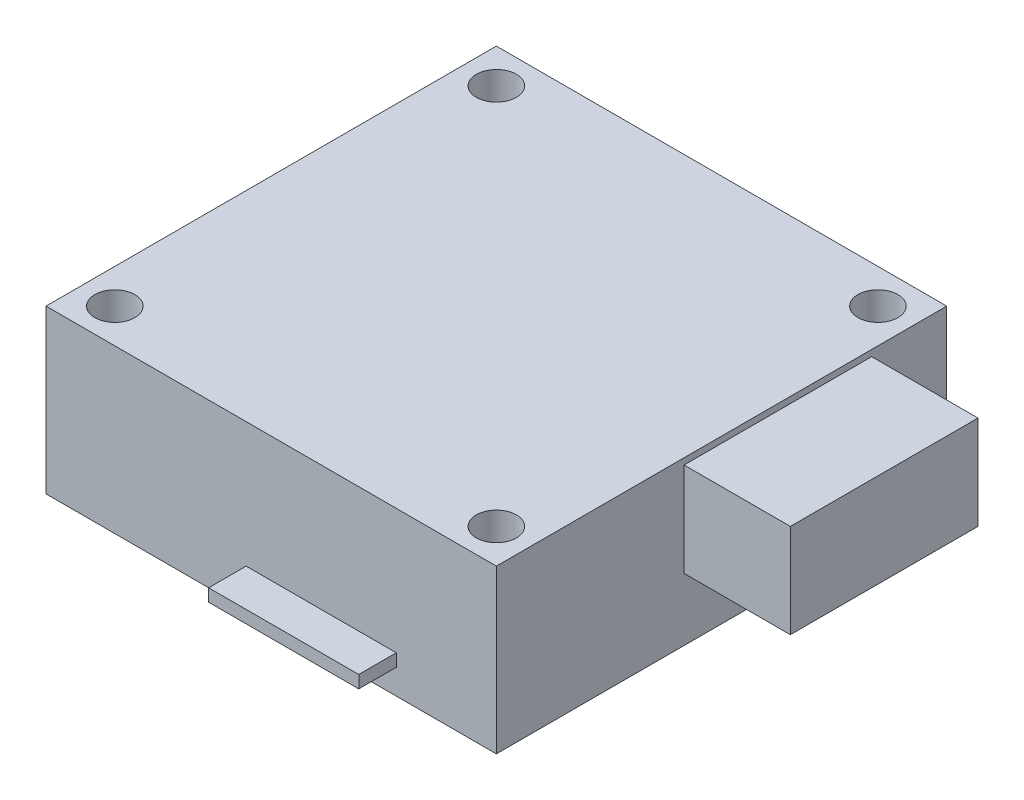
ISO-10303-21;
HEADER;
FILE_DESCRIPTION(('STEP AP214'),'2;1');
FILE_NAME('part.step','',(''),(''),'','','');
FILE_SCHEMA(('AUTOMOTIVE_DESIGN { 1 0 10303 214 1 1 1 1 }'));
ENDSEC;
DATA;
#1=APPLICATION_CONTEXT('core data for automotive mechanical design processes');
#2=APPLICATION_PROTOCOL_DEFINITION('international standard','automotive_design',2000,#1);
#3=PRODUCT_CONTEXT('',#1,'mechanical');
#4=PRODUCT('Part','Part','',(#3));
#5=PRODUCT_RELATED_PRODUCT_CATEGORY('part','',(#4));
#6=PRODUCT_DEFINITION_FORMATION('','',#4);
#7=PRODUCT_DEFINITION_CONTEXT('part definition',#1,'design');
#8=PRODUCT_DEFINITION('design','',#6,#7);
#9=PRODUCT_DEFINITION_SHAPE('','',#8);
#10=(LENGTH_UNIT() NAMED_UNIT(*) SI_UNIT(.MILLI.,.METRE.));
#11=(NAMED_UNIT(*) PLANE_ANGLE_UNIT() SI_UNIT($,.RADIAN.));
#12=(NAMED_UNIT(*) SI_UNIT($,.STERADIAN.) SOLID_ANGLE_UNIT());
#13=UNCERTAINTY_MEASURE_WITH_UNIT(LENGTH_MEASURE(1.E-05),#10,'distance_accuracy_value','');
#14=(GEOMETRIC_REPRESENTATION_CONTEXT(3) GLOBAL_UNCERTAINTY_ASSIGNED_CONTEXT((#13)) GLOBAL_UNIT_ASSIGNED_CONTEXT((#10,
#11,#12)) REPRESENTATION_CONTEXT('',''));
#15=CARTESIAN_POINT('',(0.,0.,0.));
#16=DIRECTION('',(0.,0.,1.));
#17=DIRECTION('',(1.,0.,0.));
#18=AXIS2_PLACEMENT_3D('',#15,#16,#17);
#19=CARTESIAN_POINT('',(-18.,13.,18.));
#20=DIRECTION('',(0.,0.,-1.));
#21=DIRECTION('',(-1.,0.,0.));
#22=AXIS2_PLACEMENT_3D('',#19,#20,#21);
#23=PLANE('',#22);
#24=DIRECTION('',(1.,0.,0.));
#25=VECTOR('',#24,1.);
#26=CARTESIAN_POINT('',(-18.,0.,18.));
#27=LINE('',#26,#25);
#28=CARTESIAN_POINT('',(-18.,0.,18.));
#29=VERTEX_POINT('',#28);
#30=CARTESIAN_POINT('',(18.,0.,18.));
#31=VERTEX_POINT('',#30);
#32=EDGE_CURVE('E221',#29,#31,#27,.T.);
#33=ORIENTED_EDGE('',*,*,#32,.T.);
#34=DIRECTION('',(0.,-1.,0.));
#35=VECTOR('',#34,1.);
#36=CARTESIAN_POINT('',(18.,13.,18.));
#37=LINE('',#36,#35);
#38=CARTESIAN_POINT('',(18.,13.,18.));
#39=VERTEX_POINT('',#38);
#40=EDGE_CURVE('E43',#39,#31,#37,.T.);
#41=ORIENTED_EDGE('',*,*,#40,.F.);
#42=DIRECTION('',(1.,0.,0.));
#43=VECTOR('',#42,1.);
#44=CARTESIAN_POINT('',(-18.,13.,18.));
#45=LINE('',#44,#43);
#46=CARTESIAN_POINT('',(-18.,13.,18.));
#47=VERTEX_POINT('',#46);
#48=EDGE_CURVE('E211',#47,#39,#45,.T.);
#49=ORIENTED_EDGE('',*,*,#48,.F.);
#50=DIRECTION('',(0.,-1.,0.));
#51=VECTOR('',#50,1.);
#52=CARTESIAN_POINT('',(-18.,13.,18.));
#53=LINE('',#52,#51);
#54=EDGE_CURVE('E11',#47,#29,#53,.T.);
#55=ORIENTED_EDGE('',*,*,#54,.T.);
#56=EDGE_LOOP('',(#33,#41,#49,#55));
#57=FACE_BOUND('',#56,.T.);
#58=DIRECTION('',(0.,-1.,0.));
#59=VECTOR('',#58,1.);
#60=CARTESIAN_POINT('',(-2.,3.,18.));
#61=LINE('',#60,#59);
#62=CARTESIAN_POINT('',(-2.,3.,18.));
#63=VERTEX_POINT('',#62);
#64=CARTESIAN_POINT('',(-1.99999999999999,2.,18.));
#65=VERTEX_POINT('',#64);
#66=EDGE_CURVE('E144',#63,#65,#61,.T.);
#67=ORIENTED_EDGE('',*,*,#66,.F.);
#68=DIRECTION('',(-1.,0.,0.));
#69=VECTOR('',#68,1.);
#70=CARTESIAN_POINT('',(-2.,3.,18.));
#71=LINE('',#70,#69);
#72=CARTESIAN_POINT('',(10.,3.,18.));
#73=VERTEX_POINT('',#72);
#74=EDGE_CURVE('E141',#73,#63,#71,.T.);
#75=ORIENTED_EDGE('',*,*,#74,.F.);
#76=DIRECTION('',(0.,1.,0.));
#77=VECTOR('',#76,1.);
#78=CARTESIAN_POINT('',(10.,3.,18.));
#79=LINE('',#78,#77);
#80=CARTESIAN_POINT('',(10.,2.,18.));
#81=VERTEX_POINT('',#80);
#82=EDGE_CURVE('E55',#81,#73,#79,.T.);
#83=ORIENTED_EDGE('',*,*,#82,.F.);
#84=DIRECTION('',(1.,0.,0.));
#85=VECTOR('',#84,1.);
#86=CARTESIAN_POINT('',(-2.,2.,18.));
#87=LINE('',#86,#85);
#88=EDGE_CURVE('E50',#65,#81,#87,.T.);
#89=ORIENTED_EDGE('',*,*,#88,.F.);
#90=EDGE_LOOP('',(#67,#75,#83,#89));
#91=FACE_BOUND('',#90,.T.);
#92=ADVANCED_FACE('F35',(#57,#91),#23,.F.);
#93=CARTESIAN_POINT('',(18.,13.,-18.));
#94=DIRECTION('',(-1.,0.,0.));
#95=DIRECTION('',(0.,0.,1.));
#96=AXIS2_PLACEMENT_3D('',#93,#94,#95);
#97=PLANE('',#96);
#98=DIRECTION('',(0.,0.,-1.));
#99=VECTOR('',#98,1.);
#100=CARTESIAN_POINT('',(18.,0.,-18.));
#101=LINE('',#100,#99);
#102=CARTESIAN_POINT('',(18.,0.,-18.));
#103=VERTEX_POINT('',#102);
#104=EDGE_CURVE('E223',#31,#103,#101,.T.);
#105=ORIENTED_EDGE('',*,*,#104,.T.);
#106=DIRECTION('',(0.,-1.,0.));
#107=VECTOR('',#106,1.);
#108=CARTESIAN_POINT('',(18.,13.,-18.));
#109=LINE('',#108,#107);
#110=CARTESIAN_POINT('',(18.,13.,-18.));
#111=VERTEX_POINT('',#110);
#112=EDGE_CURVE('E228',#111,#103,#109,.T.);
#113=ORIENTED_EDGE('',*,*,#112,.F.);
#114=DIRECTION('',(0.,0.,-1.));
#115=VECTOR('',#114,1.);
#116=CARTESIAN_POINT('',(18.,13.,-18.));
#117=LINE('',#116,#115);
#118=EDGE_CURVE('E214',#39,#111,#117,.T.);
#119=ORIENTED_EDGE('',*,*,#118,.F.);
#120=ORIENTED_EDGE('',*,*,#40,.T.);
#121=EDGE_LOOP('',(#105,#113,#119,#120));
#122=FACE_BOUND('',#121,.T.);
#123=DIRECTION('',(0.,-1.,0.));
#124=VECTOR('',#123,1.);
#125=CARTESIAN_POINT('',(18.,12.5,3.));
#126=LINE('',#125,#124);
#127=CARTESIAN_POINT('',(18.,12.5,3.));
#128=VERTEX_POINT('',#127);
#129=CARTESIAN_POINT('',(18.,5.,3.));
#130=VERTEX_POINT('',#129);
#131=EDGE_CURVE('E145',#128,#130,#126,.T.);
#132=ORIENTED_EDGE('',*,*,#131,.F.);
#133=DIRECTION('',(0.,0.,1.));
#134=VECTOR('',#133,1.);
#135=CARTESIAN_POINT('',(18.,12.5,3.));
#136=LINE('',#135,#134);
#137=CARTESIAN_POINT('',(18.,12.5,-12.));
#138=VERTEX_POINT('',#137);
#139=EDGE_CURVE('E158',#138,#128,#136,.T.);
#140=ORIENTED_EDGE('',*,*,#139,.F.);
#141=DIRECTION('',(0.,1.,0.));
#142=VECTOR('',#141,1.);
#143=CARTESIAN_POINT('',(18.,12.5,-12.));
#144=LINE('',#143,#142);
#145=CARTESIAN_POINT('',(18.,5.,-12.));
#146=VERTEX_POINT('',#145);
#147=EDGE_CURVE('E167',#146,#138,#144,.T.);
#148=ORIENTED_EDGE('',*,*,#147,.F.);
#149=DIRECTION('',(0.,0.,-1.));
#150=VECTOR('',#149,1.);
#151=CARTESIAN_POINT('',(18.,5.,3.));
#152=LINE('',#151,#150);
#153=EDGE_CURVE('E148',#130,#146,#152,.T.);
#154=ORIENTED_EDGE('',*,*,#153,.F.);
#155=EDGE_LOOP('',(#132,#140,#148,#154));
#156=FACE_BOUND('',#155,.T.);
#157=ADVANCED_FACE('F235',(#122,#156),#97,.F.);
#158=CARTESIAN_POINT('',(0.,13.,0.));
#159=DIRECTION('',(0.,1.,0.));
#160=DIRECTION('',(0.,0.,1.));
#161=AXIS2_PLACEMENT_3D('',#158,#159,#160);
#162=PLANE('',#161);
#163=CARTESIAN_POINT('',(15.25,13.,15.25));
#164=DIRECTION('',(0.,1.,0.));
#165=DIRECTION('',(0.,0.,1.));
#166=AXIS2_PLACEMENT_3D('',#163,#164,#165);
#167=CIRCLE('',#166,1.6);
#168=CARTESIAN_POINT('',(15.25,13.,13.65));
#169=VERTEX_POINT('',#168);
#170=EDGE_CURVE('E190',#169,#169,#167,.T.);
#171=ORIENTED_EDGE('',*,*,#170,.F.);
#172=EDGE_LOOP('',(#171));
#173=FACE_BOUND('',#172,.T.);
#174=CARTESIAN_POINT('',(-15.25,13.,-15.25));
#175=DIRECTION('',(0.,1.,0.));
#176=DIRECTION('',(0.,0.,1.));
#177=AXIS2_PLACEMENT_3D('',#174,#175,#176);
#178=CIRCLE('',#177,1.6);
#179=CARTESIAN_POINT('',(-15.25,13.,-16.85));
#180=VERTEX_POINT('',#179);
#181=EDGE_CURVE('E202',#180,#180,#178,.T.);
#182=ORIENTED_EDGE('',*,*,#181,.F.);
#183=EDGE_LOOP('',(#182));
#184=FACE_BOUND('',#183,.T.);
#185=DIRECTION('',(0.,0.,1.));
#186=VECTOR('',#185,1.);
#187=CARTESIAN_POINT('',(-18.,13.,-18.));
#188=LINE('',#187,#186);
#189=CARTESIAN_POINT('',(-18.,13.,-18.));
#190=VERTEX_POINT('',#189);
#191=EDGE_CURVE('E208',#190,#47,#188,.T.);
#192=ORIENTED_EDGE('',*,*,#191,.T.);
#193=ORIENTED_EDGE('',*,*,#48,.T.);
#194=ORIENTED_EDGE('',*,*,#118,.T.);
#195=DIRECTION('',(-1.,0.,0.));
#196=VECTOR('',#195,1.);
#197=CARTESIAN_POINT('',(-18.,13.,-18.));
#198=LINE('',#197,#196);
#199=EDGE_CURVE('E216',#111,#190,#198,.T.);
#200=ORIENTED_EDGE('',*,*,#199,.T.);
#201=EDGE_LOOP('',(#192,#193,#194,#200));
#202=FACE_BOUND('',#201,.T.);
#203=CARTESIAN_POINT('',(15.25,13.,-15.25));
#204=DIRECTION('',(0.,1.,0.));
#205=DIRECTION('',(0.,0.,-1.));
#206=AXIS2_PLACEMENT_3D('',#203,#204,#205);
#207=CIRCLE('',#206,1.6);
#208=CARTESIAN_POINT('',(15.25,13.,-16.85));
#209=VERTEX_POINT('',#208);
#210=EDGE_CURVE('E196',#209,#209,#207,.T.);
#211=ORIENTED_EDGE('',*,*,#210,.F.);
#212=EDGE_LOOP('',(#211));
#213=FACE_BOUND('',#212,.T.);
#214=CARTESIAN_POINT('',(-15.25,13.,15.25));
#215=DIRECTION('',(0.,1.,0.));
#216=DIRECTION('',(0.,0.,-1.));
#217=AXIS2_PLACEMENT_3D('',#214,#215,#216);
#218=CIRCLE('',#217,1.6);
#219=CARTESIAN_POINT('',(-15.25,13.,13.65));
#220=VERTEX_POINT('',#219);
#221=EDGE_CURVE('E184',#220,#220,#218,.T.);
#222=ORIENTED_EDGE('',*,*,#221,.F.);
#223=EDGE_LOOP('',(#222));
#224=FACE_BOUND('',#223,.T.);
#225=ADVANCED_FACE('F252',(#173,#184,#202,#213,#224),#162,.T.);
#226=CARTESIAN_POINT('',(0.,0.,0.));
#227=DIRECTION('',(0.,1.,0.));
#228=DIRECTION('',(0.,0.,1.));
#229=AXIS2_PLACEMENT_3D('',#226,#227,#228);
#230=PLANE('',#229);
#231=DIRECTION('',(0.,0.,1.));
#232=VECTOR('',#231,1.);
#233=CARTESIAN_POINT('',(-18.,0.,-18.));
#234=LINE('',#233,#232);
#235=CARTESIAN_POINT('',(-18.,0.,-18.));
#236=VERTEX_POINT('',#235);
#237=EDGE_CURVE('E205',#236,#29,#234,.T.);
#238=ORIENTED_EDGE('',*,*,#237,.F.);
#239=DIRECTION('',(-1.,0.,0.));
#240=VECTOR('',#239,1.);
#241=CARTESIAN_POINT('',(-18.,0.,-18.));
#242=LINE('',#241,#240);
#243=EDGE_CURVE('E212',#103,#236,#242,.T.);
#244=ORIENTED_EDGE('',*,*,#243,.F.);
#245=ORIENTED_EDGE('',*,*,#104,.F.);
#246=ORIENTED_EDGE('',*,*,#32,.F.);
#247=EDGE_LOOP('',(#238,#244,#245,#246));
#248=FACE_BOUND('',#247,.T.);
#249=CARTESIAN_POINT('',(-15.25,0.,-15.25));
#250=DIRECTION('',(0.,1.,0.));
#251=DIRECTION('',(0.,0.,1.));
#252=AXIS2_PLACEMENT_3D('',#249,#250,#251);
#253=CIRCLE('',#252,1.6);
#254=CARTESIAN_POINT('',(-15.25,0.,-16.85));
#255=VERTEX_POINT('',#254);
#256=EDGE_CURVE('E199',#255,#255,#253,.T.);
#257=ORIENTED_EDGE('',*,*,#256,.T.);
#258=EDGE_LOOP('',(#257));
#259=FACE_BOUND('',#258,.T.);
#260=CARTESIAN_POINT('',(15.25,0.,-15.25));
#261=DIRECTION('',(0.,1.,0.));
#262=DIRECTION('',(0.,0.,-1.));
#263=AXIS2_PLACEMENT_3D('',#260,#261,#262);
#264=CIRCLE('',#263,1.6);
#265=CARTESIAN_POINT('',(15.25,0.,-16.85));
#266=VERTEX_POINT('',#265);
#267=EDGE_CURVE('E193',#266,#266,#264,.T.);
#268=ORIENTED_EDGE('',*,*,#267,.T.);
#269=EDGE_LOOP('',(#268));
#270=FACE_BOUND('',#269,.T.);
#271=CARTESIAN_POINT('',(15.25,0.,15.25));
#272=DIRECTION('',(0.,1.,0.));
#273=DIRECTION('',(0.,0.,1.));
#274=AXIS2_PLACEMENT_3D('',#271,#272,#273);
#275=CIRCLE('',#274,1.6);
#276=CARTESIAN_POINT('',(15.25,0.,13.65));
#277=VERTEX_POINT('',#276);
#278=EDGE_CURVE('E187',#277,#277,#275,.T.);
#279=ORIENTED_EDGE('',*,*,#278,.T.);
#280=EDGE_LOOP('',(#279));
#281=FACE_BOUND('',#280,.T.);
#282=CARTESIAN_POINT('',(-15.25,0.,15.25));
#283=DIRECTION('',(0.,1.,0.));
#284=DIRECTION('',(0.,0.,-1.));
#285=AXIS2_PLACEMENT_3D('',#282,#283,#284);
#286=CIRCLE('',#285,1.6);
#287=CARTESIAN_POINT('',(-15.25,0.,13.65));
#288=VERTEX_POINT('',#287);
#289=EDGE_CURVE('E183',#288,#288,#286,.T.);
#290=ORIENTED_EDGE('',*,*,#289,.T.);
#291=EDGE_LOOP('',(#290));
#292=FACE_BOUND('',#291,.T.);
#293=ADVANCED_FACE('F242',(#248,#259,#270,#281,#292),#230,.F.);
#294=CARTESIAN_POINT('',(-18.,13.,-18.));
#295=DIRECTION('',(1.,0.,0.));
#296=DIRECTION('',(0.,0.,-1.));
#297=AXIS2_PLACEMENT_3D('',#294,#295,#296);
#298=PLANE('',#297);
#299=ORIENTED_EDGE('',*,*,#237,.T.);
#300=ORIENTED_EDGE('',*,*,#54,.F.);
#301=ORIENTED_EDGE('',*,*,#191,.F.);
#302=DIRECTION('',(0.,-1.,0.));
#303=VECTOR('',#302,1.);
#304=CARTESIAN_POINT('',(-18.,13.,-18.));
#305=LINE('',#304,#303);
#306=EDGE_CURVE('E218',#190,#236,#305,.T.);
#307=ORIENTED_EDGE('',*,*,#306,.T.);
#308=EDGE_LOOP('',(#299,#300,#301,#307));
#309=FACE_BOUND('',#308,.T.);
#310=ADVANCED_FACE('F37',(#309),#298,.F.);
#311=CARTESIAN_POINT('',(-18.,13.,-18.));
#312=DIRECTION('',(0.,0.,1.));
#313=DIRECTION('',(1.,0.,0.));
#314=AXIS2_PLACEMENT_3D('',#311,#312,#313);
#315=PLANE('',#314);
#316=ORIENTED_EDGE('',*,*,#243,.T.);
#317=ORIENTED_EDGE('',*,*,#306,.F.);
#318=ORIENTED_EDGE('',*,*,#199,.F.);
#319=ORIENTED_EDGE('',*,*,#112,.T.);
#320=EDGE_LOOP('',(#316,#317,#318,#319));
#321=FACE_BOUND('',#320,.T.);
#322=ADVANCED_FACE('F246',(#321),#315,.F.);
#323=CARTESIAN_POINT('',(-15.25,13.,-15.25));
#324=DIRECTION('',(0.,-1.,0.));
#325=DIRECTION('',(0.,0.,-1.));
#326=AXIS2_PLACEMENT_3D('',#323,#324,#325);
#327=CYLINDRICAL_SURFACE('',#326,1.6);
#328=CARTESIAN_POINT('',(-15.25,13.,-16.85));
#329=CARTESIAN_POINT('',(-15.25,12.8645833333333,-16.85));
#330=CARTESIAN_POINT('',(-15.25,12.7291666666667,-16.85));
#331=CARTESIAN_POINT('',(-15.25,12.4583333333333,-16.85));
#332=CARTESIAN_POINT('',(-15.25,12.3229166666667,-16.85));
#333=CARTESIAN_POINT('',(-15.25,12.0520833333333,-16.85));
#334=CARTESIAN_POINT('',(-15.25,11.9166666666667,-16.85));
#335=CARTESIAN_POINT('',(-15.25,11.6458333333333,-16.85));
#336=CARTESIAN_POINT('',(-15.25,11.5104166666667,-16.85));
#337=CARTESIAN_POINT('',(-15.25,11.2395833333333,-16.85));
#338=CARTESIAN_POINT('',(-15.25,11.1041666666667,-16.85));
#339=CARTESIAN_POINT('',(-15.25,10.8333333333333,-16.85));
#340=CARTESIAN_POINT('',(-15.25,10.6979166666667,-16.85));
#341=CARTESIAN_POINT('',(-15.25,10.4270833333333,-16.85));
#342=CARTESIAN_POINT('',(-15.25,10.2916666666667,-16.85));
#343=CARTESIAN_POINT('',(-15.25,10.0208333333333,-16.85));
#344=CARTESIAN_POINT('',(-15.25,9.88541666666667,-16.85));
#345=CARTESIAN_POINT('',(-15.25,9.61458333333333,-16.85));
#346=CARTESIAN_POINT('',(-15.25,9.47916666666667,-16.85));
#347=CARTESIAN_POINT('',(-15.25,9.20833333333333,-16.85));
#348=CARTESIAN_POINT('',(-15.25,9.07291666666666,-16.85));
#349=CARTESIAN_POINT('',(-15.25,8.80208333333333,-16.85));
#350=CARTESIAN_POINT('',(-15.25,8.66666666666667,-16.85));
#351=CARTESIAN_POINT('',(-15.25,8.39583333333333,-16.85));
#352=CARTESIAN_POINT('',(-15.25,8.26041666666667,-16.85));
#353=CARTESIAN_POINT('',(-15.25,7.98958333333333,-16.85));
#354=CARTESIAN_POINT('',(-15.25,7.85416666666667,-16.85));
#355=CARTESIAN_POINT('',(-15.25,7.58333333333333,-16.85));
#356=CARTESIAN_POINT('',(-15.25,7.44791666666667,-16.85));
#357=CARTESIAN_POINT('',(-15.25,7.17708333333333,-16.85));
#358=CARTESIAN_POINT('',(-15.25,7.04166666666667,-16.85));
#359=CARTESIAN_POINT('',(-15.25,6.77083333333333,-16.85));
#360=CARTESIAN_POINT('',(-15.25,6.63541666666667,-16.85));
#361=CARTESIAN_POINT('',(-15.25,6.36458333333333,-16.85));
#362=CARTESIAN_POINT('',(-15.25,6.22916666666667,-16.85));
#363=CARTESIAN_POINT('',(-15.25,5.95833333333333,-16.85));
#364=CARTESIAN_POINT('',(-15.25,5.82291666666667,-16.85));
#365=CARTESIAN_POINT('',(-15.25,5.55208333333333,-16.85));
#366=CARTESIAN_POINT('',(-15.25,5.41666666666667,-16.85));
#367=CARTESIAN_POINT('',(-15.25,5.14583333333333,-16.85));
#368=CARTESIAN_POINT('',(-15.25,5.01041666666667,-16.85));
#369=CARTESIAN_POINT('',(-15.25,4.73958333333333,-16.85));
#370=CARTESIAN_POINT('',(-15.25,4.60416666666667,-16.85));
#371=CARTESIAN_POINT('',(-15.25,4.33333333333333,-16.85));
#372=CARTESIAN_POINT('',(-15.25,4.19791666666667,-16.85));
#373=CARTESIAN_POINT('',(-15.25,3.92708333333333,-16.85));
#374=CARTESIAN_POINT('',(-15.25,3.79166666666667,-16.85));
#375=CARTESIAN_POINT('',(-15.25,3.52083333333333,-16.85));
#376=CARTESIAN_POINT('',(-15.25,3.38541666666667,-16.85));
#377=CARTESIAN_POINT('',(-15.25,3.11458333333333,-16.85));
#378=CARTESIAN_POINT('',(-15.25,2.97916666666667,-16.85));
#379=CARTESIAN_POINT('',(-15.25,2.70833333333333,-16.85));
#380=CARTESIAN_POINT('',(-15.25,2.57291666666667,-16.85));
#381=CARTESIAN_POINT('',(-15.25,2.30208333333333,-16.85));
#382=CARTESIAN_POINT('',(-15.25,2.16666666666667,-16.85));
#383=CARTESIAN_POINT('',(-15.25,1.89583333333333,-16.85));
#384=CARTESIAN_POINT('',(-15.25,1.76041666666667,-16.85));
#385=CARTESIAN_POINT('',(-15.25,1.48958333333333,-16.85));
#386=CARTESIAN_POINT('',(-15.25,1.35416666666667,-16.85));
#387=CARTESIAN_POINT('',(-15.25,1.08333333333333,-16.85));
#388=CARTESIAN_POINT('',(-15.25,0.947916666666667,-16.85));
#389=CARTESIAN_POINT('',(-15.25,0.677083333333334,-16.85));
#390=CARTESIAN_POINT('',(-15.25,0.541666666666667,-16.85));
#391=CARTESIAN_POINT('',(-15.25,0.270833333333334,-16.85));
#392=CARTESIAN_POINT('',(-15.25,0.135416666666667,-16.85));
#393=CARTESIAN_POINT('',(-15.25,0.,-16.85));
#394=B_SPLINE_CURVE_WITH_KNOTS('',3,(#328,#329,#330,#331,#332,#333,#334,#335,#336,#337,#338,
#339,#340,#341,#342,#343,#344,#345,#346,#347,#348,#349,#350,#351,#352,#353,#354,#355,#356,#357,
#358,#359,#360,#361,#362,#363,#364,#365,#366,#367,#368,#369,#370,#371,#372,#373,#374,#375,#376,
#377,#378,#379,#380,#381,#382,#383,#384,#385,#386,#387,#388,#389,#390,#391,#392,#393),
.UNSPECIFIED.,.F.,.F.,(4,2,2,2,2,2,2,2,2,2,2,2,2,2,2,2,2,2,2,2,2,2,2,2,2,2,2,2,2,2,2,2,4),(0.,
0.40625,0.812500000000001,1.21875,1.625,2.03125,2.4375,2.84375,3.25,3.65625,4.0625,4.46875,
4.875,5.28125,5.6875,6.09375,6.5,6.90625,7.3125,7.71875,8.125,8.53125,8.9375,9.34375,9.75,
10.15625,10.5625,10.96875,11.375,11.78125,12.1875,12.59375,13.),.UNSPECIFIED.);
#395=EDGE_CURVE('BSEAM313',#180,#255,#394,.T.);
#396=ORIENTED_EDGE('',*,*,#181,.T.);
#397=ORIENTED_EDGE('',*,*,#256,.F.);
#398=ORIENTED_EDGE('',*,*,#395,.T.);
#399=ORIENTED_EDGE('',*,*,#395,.F.);
#400=EDGE_LOOP('',(#396,#398,#397,#399));
#401=FACE_BOUND('',#400,.T.);
#402=ADVANCED_FACE('F313',(#401),#327,.F.);
#403=CARTESIAN_POINT('',(15.25,13.,-15.25));
#404=DIRECTION('',(0.,-1.,0.));
#405=DIRECTION('',(0.,0.,-1.));
#406=AXIS2_PLACEMENT_3D('',#403,#404,#405);
#407=CYLINDRICAL_SURFACE('',#406,1.6);
#408=CARTESIAN_POINT('',(15.25,13.,-16.85));
#409=CARTESIAN_POINT('',(15.25,12.8645833333333,-16.85));
#410=CARTESIAN_POINT('',(15.25,12.7291666666667,-16.85));
#411=CARTESIAN_POINT('',(15.25,12.4583333333333,-16.85));
#412=CARTESIAN_POINT('',(15.25,12.3229166666667,-16.85));
#413=CARTESIAN_POINT('',(15.25,12.0520833333333,-16.85));
#414=CARTESIAN_POINT('',(15.25,11.9166666666667,-16.85));
#415=CARTESIAN_POINT('',(15.25,11.6458333333333,-16.85));
#416=CARTESIAN_POINT('',(15.25,11.5104166666667,-16.85));
#417=CARTESIAN_POINT('',(15.25,11.2395833333333,-16.85));
#418=CARTESIAN_POINT('',(15.25,11.1041666666667,-16.85));
#419=CARTESIAN_POINT('',(15.25,10.8333333333333,-16.85));
#420=CARTESIAN_POINT('',(15.25,10.6979166666667,-16.85));
#421=CARTESIAN_POINT('',(15.25,10.4270833333333,-16.85));
#422=CARTESIAN_POINT('',(15.25,10.2916666666667,-16.85));
#423=CARTESIAN_POINT('',(15.25,10.0208333333333,-16.85));
#424=CARTESIAN_POINT('',(15.25,9.88541666666667,-16.85));
#425=CARTESIAN_POINT('',(15.25,9.61458333333333,-16.85));
#426=CARTESIAN_POINT('',(15.25,9.47916666666667,-16.85));
#427=CARTESIAN_POINT('',(15.25,9.20833333333333,-16.85));
#428=CARTESIAN_POINT('',(15.25,9.07291666666666,-16.85));
#429=CARTESIAN_POINT('',(15.25,8.80208333333333,-16.85));
#430=CARTESIAN_POINT('',(15.25,8.66666666666667,-16.85));
#431=CARTESIAN_POINT('',(15.25,8.39583333333333,-16.85));
#432=CARTESIAN_POINT('',(15.25,8.26041666666667,-16.85));
#433=CARTESIAN_POINT('',(15.25,7.98958333333333,-16.85));
#434=CARTESIAN_POINT('',(15.25,7.85416666666667,-16.85));
#435=CARTESIAN_POINT('',(15.25,7.58333333333333,-16.85));
#436=CARTESIAN_POINT('',(15.25,7.44791666666667,-16.85));
#437=CARTESIAN_POINT('',(15.25,7.17708333333333,-16.85));
#438=CARTESIAN_POINT('',(15.25,7.04166666666667,-16.85));
#439=CARTESIAN_POINT('',(15.25,6.77083333333333,-16.85));
#440=CARTESIAN_POINT('',(15.25,6.63541666666667,-16.85));
#441=CARTESIAN_POINT('',(15.25,6.36458333333333,-16.85));
#442=CARTESIAN_POINT('',(15.25,6.22916666666667,-16.85));
#443=CARTESIAN_POINT('',(15.25,5.95833333333333,-16.85));
#444=CARTESIAN_POINT('',(15.25,5.82291666666667,-16.85));
#445=CARTESIAN_POINT('',(15.25,5.55208333333333,-16.85));
#446=CARTESIAN_POINT('',(15.25,5.41666666666667,-16.85));
#447=CARTESIAN_POINT('',(15.25,5.14583333333333,-16.85));
#448=CARTESIAN_POINT('',(15.25,5.01041666666667,-16.85));
#449=CARTESIAN_POINT('',(15.25,4.73958333333333,-16.85));
#450=CARTESIAN_POINT('',(15.25,4.60416666666667,-16.85));
#451=CARTESIAN_POINT('',(15.25,4.33333333333333,-16.85));
#452=CARTESIAN_POINT('',(15.25,4.19791666666667,-16.85));
#453=CARTESIAN_POINT('',(15.25,3.92708333333333,-16.85));
#454=CARTESIAN_POINT('',(15.25,3.79166666666667,-16.85));
#455=CARTESIAN_POINT('',(15.25,3.52083333333333,-16.85));
#456=CARTESIAN_POINT('',(15.25,3.38541666666667,-16.85));
#457=CARTESIAN_POINT('',(15.25,3.11458333333333,-16.85));
#458=CARTESIAN_POINT('',(15.25,2.97916666666667,-16.85));
#459=CARTESIAN_POINT('',(15.25,2.70833333333333,-16.85));
#460=CARTESIAN_POINT('',(15.25,2.57291666666667,-16.85));
#461=CARTESIAN_POINT('',(15.25,2.30208333333333,-16.85));
#462=CARTESIAN_POINT('',(15.25,2.16666666666667,-16.85));
#463=CARTESIAN_POINT('',(15.25,1.89583333333333,-16.85));
#464=CARTESIAN_POINT('',(15.25,1.76041666666667,-16.85));
#465=CARTESIAN_POINT('',(15.25,1.48958333333333,-16.85));
#466=CARTESIAN_POINT('',(15.25,1.35416666666667,-16.85));
#467=CARTESIAN_POINT('',(15.25,1.08333333333333,-16.85));
#468=CARTESIAN_POINT('',(15.25,0.947916666666667,-16.85));
#469=CARTESIAN_POINT('',(15.25,0.677083333333334,-16.85));
#470=CARTESIAN_POINT('',(15.25,0.541666666666667,-16.85));
#471=CARTESIAN_POINT('',(15.25,0.270833333333334,-16.85));
#472=CARTESIAN_POINT('',(15.25,0.135416666666667,-16.85));
#473=CARTESIAN_POINT('',(15.25,0.,-16.85));
#474=B_SPLINE_CURVE_WITH_KNOTS('',3,(#408,#409,#410,#411,#412,#413,#414,#415,#416,#417,#418,
#419,#420,#421,#422,#423,#424,#425,#426,#427,#428,#429,#430,#431,#432,#433,#434,#435,#436,#437,
#438,#439,#440,#441,#442,#443,#444,#445,#446,#447,#448,#449,#450,#451,#452,#453,#454,#455,#456,
#457,#458,#459,#460,#461,#462,#463,#464,#465,#466,#467,#468,#469,#470,#471,#472,#473),
.UNSPECIFIED.,.F.,.F.,(4,2,2,2,2,2,2,2,2,2,2,2,2,2,2,2,2,2,2,2,2,2,2,2,2,2,2,2,2,2,2,2,4),(0.,
0.40625,0.812500000000001,1.21875,1.625,2.03125,2.4375,2.84375,3.25,3.65625,4.0625,4.46875,
4.875,5.28125,5.6875,6.09375,6.5,6.90625,7.3125,7.71875,8.125,8.53125,8.9375,9.34375,9.75,
10.15625,10.5625,10.96875,11.375,11.78125,12.1875,12.59375,13.),.UNSPECIFIED.);
#475=EDGE_CURVE('BSEAM309',#209,#266,#474,.T.);
#476=ORIENTED_EDGE('',*,*,#210,.T.);
#477=ORIENTED_EDGE('',*,*,#267,.F.);
#478=ORIENTED_EDGE('',*,*,#475,.T.);
#479=ORIENTED_EDGE('',*,*,#475,.F.);
#480=EDGE_LOOP('',(#476,#478,#477,#479));
#481=FACE_BOUND('',#480,.T.);
#482=ADVANCED_FACE('F309',(#481),#407,.F.);
#483=CARTESIAN_POINT('',(15.25,13.,15.25));
#484=DIRECTION('',(0.,-1.,0.));
#485=DIRECTION('',(0.,0.,-1.));
#486=AXIS2_PLACEMENT_3D('',#483,#484,#485);
#487=CYLINDRICAL_SURFACE('',#486,1.6);
#488=CARTESIAN_POINT('',(15.25,13.,13.65));
#489=CARTESIAN_POINT('',(15.25,12.8645833333333,13.65));
#490=CARTESIAN_POINT('',(15.25,12.7291666666667,13.65));
#491=CARTESIAN_POINT('',(15.25,12.4583333333333,13.65));
#492=CARTESIAN_POINT('',(15.25,12.3229166666667,13.65));
#493=CARTESIAN_POINT('',(15.25,12.0520833333333,13.65));
#494=CARTESIAN_POINT('',(15.25,11.9166666666667,13.65));
#495=CARTESIAN_POINT('',(15.25,11.6458333333333,13.65));
#496=CARTESIAN_POINT('',(15.25,11.5104166666667,13.65));
#497=CARTESIAN_POINT('',(15.25,11.2395833333333,13.65));
#498=CARTESIAN_POINT('',(15.25,11.1041666666667,13.65));
#499=CARTESIAN_POINT('',(15.25,10.8333333333333,13.65));
#500=CARTESIAN_POINT('',(15.25,10.6979166666667,13.65));
#501=CARTESIAN_POINT('',(15.25,10.4270833333333,13.65));
#502=CARTESIAN_POINT('',(15.25,10.2916666666667,13.65));
#503=CARTESIAN_POINT('',(15.25,10.0208333333333,13.65));
#504=CARTESIAN_POINT('',(15.25,9.88541666666667,13.65));
#505=CARTESIAN_POINT('',(15.25,9.61458333333333,13.65));
#506=CARTESIAN_POINT('',(15.25,9.47916666666667,13.65));
#507=CARTESIAN_POINT('',(15.25,9.20833333333333,13.65));
#508=CARTESIAN_POINT('',(15.25,9.07291666666666,13.65));
#509=CARTESIAN_POINT('',(15.25,8.80208333333333,13.65));
#510=CARTESIAN_POINT('',(15.25,8.66666666666667,13.65));
#511=CARTESIAN_POINT('',(15.25,8.39583333333333,13.65));
#512=CARTESIAN_POINT('',(15.25,8.26041666666667,13.65));
#513=CARTESIAN_POINT('',(15.25,7.98958333333333,13.65));
#514=CARTESIAN_POINT('',(15.25,7.85416666666667,13.65));
#515=CARTESIAN_POINT('',(15.25,7.58333333333333,13.65));
#516=CARTESIAN_POINT('',(15.25,7.44791666666667,13.65));
#517=CARTESIAN_POINT('',(15.25,7.17708333333333,13.65));
#518=CARTESIAN_POINT('',(15.25,7.04166666666667,13.65));
#519=CARTESIAN_POINT('',(15.25,6.77083333333333,13.65));
#520=CARTESIAN_POINT('',(15.25,6.63541666666667,13.65));
#521=CARTESIAN_POINT('',(15.25,6.36458333333333,13.65));
#522=CARTESIAN_POINT('',(15.25,6.22916666666667,13.65));
#523=CARTESIAN_POINT('',(15.25,5.95833333333333,13.65));
#524=CARTESIAN_POINT('',(15.25,5.82291666666667,13.65));
#525=CARTESIAN_POINT('',(15.25,5.55208333333333,13.65));
#526=CARTESIAN_POINT('',(15.25,5.41666666666667,13.65));
#527=CARTESIAN_POINT('',(15.25,5.14583333333333,13.65));
#528=CARTESIAN_POINT('',(15.25,5.01041666666667,13.65));
#529=CARTESIAN_POINT('',(15.25,4.73958333333333,13.65));
#530=CARTESIAN_POINT('',(15.25,4.60416666666667,13.65));
#531=CARTESIAN_POINT('',(15.25,4.33333333333333,13.65));
#532=CARTESIAN_POINT('',(15.25,4.19791666666667,13.65));
#533=CARTESIAN_POINT('',(15.25,3.92708333333333,13.65));
#534=CARTESIAN_POINT('',(15.25,3.79166666666667,13.65));
#535=CARTESIAN_POINT('',(15.25,3.52083333333333,13.65));
#536=CARTESIAN_POINT('',(15.25,3.38541666666667,13.65));
#537=CARTESIAN_POINT('',(15.25,3.11458333333333,13.65));
#538=CARTESIAN_POINT('',(15.25,2.97916666666667,13.65));
#539=CARTESIAN_POINT('',(15.25,2.70833333333333,13.65));
#540=CARTESIAN_POINT('',(15.25,2.57291666666667,13.65));
#541=CARTESIAN_POINT('',(15.25,2.30208333333333,13.65));
#542=CARTESIAN_POINT('',(15.25,2.16666666666667,13.65));
#543=CARTESIAN_POINT('',(15.25,1.89583333333333,13.65));
#544=CARTESIAN_POINT('',(15.25,1.76041666666667,13.65));
#545=CARTESIAN_POINT('',(15.25,1.48958333333333,13.65));
#546=CARTESIAN_POINT('',(15.25,1.35416666666667,13.65));
#547=CARTESIAN_POINT('',(15.25,1.08333333333333,13.65));
#548=CARTESIAN_POINT('',(15.25,0.947916666666667,13.65));
#549=CARTESIAN_POINT('',(15.25,0.677083333333334,13.65));
#550=CARTESIAN_POINT('',(15.25,0.541666666666667,13.65));
#551=CARTESIAN_POINT('',(15.25,0.270833333333334,13.65));
#552=CARTESIAN_POINT('',(15.25,0.135416666666667,13.65));
#553=CARTESIAN_POINT('',(15.25,0.,13.65));
#554=B_SPLINE_CURVE_WITH_KNOTS('',3,(#488,#489,#490,#491,#492,#493,#494,#495,#496,#497,#498,
#499,#500,#501,#502,#503,#504,#505,#506,#507,#508,#509,#510,#511,#512,#513,#514,#515,#516,#517,
#518,#519,#520,#521,#522,#523,#524,#525,#526,#527,#528,#529,#530,#531,#532,#533,#534,#535,#536,
#537,#538,#539,#540,#541,#542,#543,#544,#545,#546,#547,#548,#549,#550,#551,#552,#553),
.UNSPECIFIED.,.F.,.F.,(4,2,2,2,2,2,2,2,2,2,2,2,2,2,2,2,2,2,2,2,2,2,2,2,2,2,2,2,2,2,2,2,4),(0.,
0.40625,0.812500000000001,1.21875,1.625,2.03125,2.4375,2.84375,3.25,3.65625,4.0625,4.46875,
4.875,5.28125,5.6875,6.09375,6.5,6.90625,7.3125,7.71875,8.125,8.53125,8.9375,9.34375,9.75,
10.15625,10.5625,10.96875,11.375,11.78125,12.1875,12.59375,13.),.UNSPECIFIED.);
#555=EDGE_CURVE('BSEAM305',#169,#277,#554,.T.);
#556=ORIENTED_EDGE('',*,*,#170,.T.);
#557=ORIENTED_EDGE('',*,*,#278,.F.);
#558=ORIENTED_EDGE('',*,*,#555,.T.);
#559=ORIENTED_EDGE('',*,*,#555,.F.);
#560=EDGE_LOOP('',(#556,#558,#557,#559));
#561=FACE_BOUND('',#560,.T.);
#562=ADVANCED_FACE('F305',(#561),#487,.F.);
#563=CARTESIAN_POINT('',(-15.25,13.,15.25));
#564=DIRECTION('',(0.,-1.,0.));
#565=DIRECTION('',(0.,0.,-1.));
#566=AXIS2_PLACEMENT_3D('',#563,#564,#565);
#567=CYLINDRICAL_SURFACE('',#566,1.6);
#568=CARTESIAN_POINT('',(-15.25,13.,13.65));
#569=CARTESIAN_POINT('',(-15.25,12.8645833333333,13.65));
#570=CARTESIAN_POINT('',(-15.25,12.7291666666667,13.65));
#571=CARTESIAN_POINT('',(-15.25,12.4583333333333,13.65));
#572=CARTESIAN_POINT('',(-15.25,12.3229166666667,13.65));
#573=CARTESIAN_POINT('',(-15.25,12.0520833333333,13.65));
#574=CARTESIAN_POINT('',(-15.25,11.9166666666667,13.65));
#575=CARTESIAN_POINT('',(-15.25,11.6458333333333,13.65));
#576=CARTESIAN_POINT('',(-15.25,11.5104166666667,13.65));
#577=CARTESIAN_POINT('',(-15.25,11.2395833333333,13.65));
#578=CARTESIAN_POINT('',(-15.25,11.1041666666667,13.65));
#579=CARTESIAN_POINT('',(-15.25,10.8333333333333,13.65));
#580=CARTESIAN_POINT('',(-15.25,10.6979166666667,13.65));
#581=CARTESIAN_POINT('',(-15.25,10.4270833333333,13.65));
#582=CARTESIAN_POINT('',(-15.25,10.2916666666667,13.65));
#583=CARTESIAN_POINT('',(-15.25,10.0208333333333,13.65));
#584=CARTESIAN_POINT('',(-15.25,9.88541666666667,13.65));
#585=CARTESIAN_POINT('',(-15.25,9.61458333333333,13.65));
#586=CARTESIAN_POINT('',(-15.25,9.47916666666667,13.65));
#587=CARTESIAN_POINT('',(-15.25,9.20833333333333,13.65));
#588=CARTESIAN_POINT('',(-15.25,9.07291666666666,13.65));
#589=CARTESIAN_POINT('',(-15.25,8.80208333333333,13.65));
#590=CARTESIAN_POINT('',(-15.25,8.66666666666667,13.65));
#591=CARTESIAN_POINT('',(-15.25,8.39583333333333,13.65));
#592=CARTESIAN_POINT('',(-15.25,8.26041666666667,13.65));
#593=CARTESIAN_POINT('',(-15.25,7.98958333333333,13.65));
#594=CARTESIAN_POINT('',(-15.25,7.85416666666667,13.65));
#595=CARTESIAN_POINT('',(-15.25,7.58333333333333,13.65));
#596=CARTESIAN_POINT('',(-15.25,7.44791666666667,13.65));
#597=CARTESIAN_POINT('',(-15.25,7.17708333333333,13.65));
#598=CARTESIAN_POINT('',(-15.25,7.04166666666667,13.65));
#599=CARTESIAN_POINT('',(-15.25,6.77083333333333,13.65));
#600=CARTESIAN_POINT('',(-15.25,6.63541666666667,13.65));
#601=CARTESIAN_POINT('',(-15.25,6.36458333333333,13.65));
#602=CARTESIAN_POINT('',(-15.25,6.22916666666667,13.65));
#603=CARTESIAN_POINT('',(-15.25,5.95833333333333,13.65));
#604=CARTESIAN_POINT('',(-15.25,5.82291666666667,13.65));
#605=CARTESIAN_POINT('',(-15.25,5.55208333333333,13.65));
#606=CARTESIAN_POINT('',(-15.25,5.41666666666667,13.65));
#607=CARTESIAN_POINT('',(-15.25,5.14583333333333,13.65));
#608=CARTESIAN_POINT('',(-15.25,5.01041666666667,13.65));
#609=CARTESIAN_POINT('',(-15.25,4.73958333333333,13.65));
#610=CARTESIAN_POINT('',(-15.25,4.60416666666667,13.65));
#611=CARTESIAN_POINT('',(-15.25,4.33333333333333,13.65));
#612=CARTESIAN_POINT('',(-15.25,4.19791666666667,13.65));
#613=CARTESIAN_POINT('',(-15.25,3.92708333333333,13.65));
#614=CARTESIAN_POINT('',(-15.25,3.79166666666667,13.65));
#615=CARTESIAN_POINT('',(-15.25,3.52083333333333,13.65));
#616=CARTESIAN_POINT('',(-15.25,3.38541666666667,13.65));
#617=CARTESIAN_POINT('',(-15.25,3.11458333333333,13.65));
#618=CARTESIAN_POINT('',(-15.25,2.97916666666667,13.65));
#619=CARTESIAN_POINT('',(-15.25,2.70833333333333,13.65));
#620=CARTESIAN_POINT('',(-15.25,2.57291666666667,13.65));
#621=CARTESIAN_POINT('',(-15.25,2.30208333333333,13.65));
#622=CARTESIAN_POINT('',(-15.25,2.16666666666667,13.65));
#623=CARTESIAN_POINT('',(-15.25,1.89583333333333,13.65));
#624=CARTESIAN_POINT('',(-15.25,1.76041666666667,13.65));
#625=CARTESIAN_POINT('',(-15.25,1.48958333333333,13.65));
#626=CARTESIAN_POINT('',(-15.25,1.35416666666667,13.65));
#627=CARTESIAN_POINT('',(-15.25,1.08333333333333,13.65));
#628=CARTESIAN_POINT('',(-15.25,0.947916666666667,13.65));
#629=CARTESIAN_POINT('',(-15.25,0.677083333333334,13.65));
#630=CARTESIAN_POINT('',(-15.25,0.541666666666667,13.65));
#631=CARTESIAN_POINT('',(-15.25,0.270833333333334,13.65));
#632=CARTESIAN_POINT('',(-15.25,0.135416666666667,13.65));
#633=CARTESIAN_POINT('',(-15.25,0.,13.65));
#634=B_SPLINE_CURVE_WITH_KNOTS('',3,(#568,#569,#570,#571,#572,#573,#574,#575,#576,#577,#578,
#579,#580,#581,#582,#583,#584,#585,#586,#587,#588,#589,#590,#591,#592,#593,#594,#595,#596,#597,
#598,#599,#600,#601,#602,#603,#604,#605,#606,#607,#608,#609,#610,#611,#612,#613,#614,#615,#616,
#617,#618,#619,#620,#621,#622,#623,#624,#625,#626,#627,#628,#629,#630,#631,#632,#633),
.UNSPECIFIED.,.F.,.F.,(4,2,2,2,2,2,2,2,2,2,2,2,2,2,2,2,2,2,2,2,2,2,2,2,2,2,2,2,2,2,2,2,4),(0.,
0.40625,0.812500000000001,1.21875,1.625,2.03125,2.4375,2.84375,3.25,3.65625,4.0625,4.46875,
4.875,5.28125,5.6875,6.09375,6.5,6.90625,7.3125,7.71875,8.125,8.53125,8.9375,9.34375,9.75,
10.15625,10.5625,10.96875,11.375,11.78125,12.1875,12.59375,13.),.UNSPECIFIED.);
#635=EDGE_CURVE('BSEAM301',#220,#288,#634,.T.);
#636=ORIENTED_EDGE('',*,*,#221,.T.);
#637=ORIENTED_EDGE('',*,*,#289,.F.);
#638=ORIENTED_EDGE('',*,*,#635,.T.);
#639=ORIENTED_EDGE('',*,*,#635,.F.);
#640=EDGE_LOOP('',(#636,#638,#637,#639));
#641=FACE_BOUND('',#640,.T.);
#642=ADVANCED_FACE('F301',(#641),#567,.F.);
#643=CARTESIAN_POINT('',(26.5,12.5,3.));
#644=DIRECTION('',(0.,0.,-1.));
#645=DIRECTION('',(0.,1.,0.));
#646=AXIS2_PLACEMENT_3D('',#643,#644,#645);
#647=PLANE('',#646);
#648=ORIENTED_EDGE('',*,*,#131,.T.);
#649=DIRECTION('',(-1.,0.,0.));
#650=VECTOR('',#649,1.);
#651=CARTESIAN_POINT('',(26.5,5.,2.99999999999999));
#652=LINE('',#651,#650);
#653=CARTESIAN_POINT('',(26.5,5.,2.99999999999999));
#654=VERTEX_POINT('',#653);
#655=EDGE_CURVE('E180',#654,#130,#652,.T.);
#656=ORIENTED_EDGE('',*,*,#655,.F.);
#657=DIRECTION('',(0.,-1.,0.));
#658=VECTOR('',#657,1.);
#659=CARTESIAN_POINT('',(26.5,12.5,3.));
#660=LINE('',#659,#658);
#661=CARTESIAN_POINT('',(26.5,12.5,3.));
#662=VERTEX_POINT('',#661);
#663=EDGE_CURVE('E154',#662,#654,#660,.T.);
#664=ORIENTED_EDGE('',*,*,#663,.F.);
#665=DIRECTION('',(-1.,0.,0.));
#666=VECTOR('',#665,1.);
#667=CARTESIAN_POINT('',(26.5,12.5,3.));
#668=LINE('',#667,#666);
#669=EDGE_CURVE('E163',#662,#128,#668,.T.);
#670=ORIENTED_EDGE('',*,*,#669,.T.);
#671=EDGE_LOOP('',(#648,#656,#664,#670));
#672=FACE_BOUND('',#671,.T.);
#673=ADVANCED_FACE('F297',(#672),#647,.F.);
#674=CARTESIAN_POINT('',(26.5,5.,2.99999999999999));
#675=DIRECTION('',(0.,1.,0.));
#676=DIRECTION('',(0.,0.,1.));
#677=AXIS2_PLACEMENT_3D('',#674,#675,#676);
#678=PLANE('',#677);
#679=ORIENTED_EDGE('',*,*,#153,.T.);
#680=DIRECTION('',(-1.,0.,0.));
#681=VECTOR('',#680,1.);
#682=CARTESIAN_POINT('',(26.5,5.,-12.));
#683=LINE('',#682,#681);
#684=CARTESIAN_POINT('',(26.5,5.,-12.));
#685=VERTEX_POINT('',#684);
#686=EDGE_CURVE('E177',#685,#146,#683,.T.);
#687=ORIENTED_EDGE('',*,*,#686,.F.);
#688=DIRECTION('',(0.,0.,-1.));
#689=VECTOR('',#688,1.);
#690=CARTESIAN_POINT('',(26.5,5.,2.99999999999999));
#691=LINE('',#690,#689);
#692=EDGE_CURVE('E157',#654,#685,#691,.T.);
#693=ORIENTED_EDGE('',*,*,#692,.F.);
#694=ORIENTED_EDGE('',*,*,#655,.T.);
#695=EDGE_LOOP('',(#679,#687,#693,#694));
#696=FACE_BOUND('',#695,.T.);
#697=ADVANCED_FACE('F293',(#696),#678,.F.);
#698=CARTESIAN_POINT('',(26.5,12.5,-12.));
#699=DIRECTION('',(0.,0.,1.));
#700=DIRECTION('',(0.,-1.,0.));
#701=AXIS2_PLACEMENT_3D('',#698,#699,#700);
#702=PLANE('',#701);
#703=ORIENTED_EDGE('',*,*,#147,.T.);
#704=DIRECTION('',(-1.,0.,0.));
#705=VECTOR('',#704,1.);
#706=CARTESIAN_POINT('',(26.5,12.5,-12.));
#707=LINE('',#706,#705);
#708=CARTESIAN_POINT('',(26.5,12.5,-12.));
#709=VERTEX_POINT('',#708);
#710=EDGE_CURVE('E174',#709,#138,#707,.T.);
#711=ORIENTED_EDGE('',*,*,#710,.F.);
#712=DIRECTION('',(0.,1.,0.));
#713=VECTOR('',#712,1.);
#714=CARTESIAN_POINT('',(26.5,12.5,-12.));
#715=LINE('',#714,#713);
#716=EDGE_CURVE('E160',#685,#709,#715,.T.);
#717=ORIENTED_EDGE('',*,*,#716,.F.);
#718=ORIENTED_EDGE('',*,*,#686,.T.);
#719=EDGE_LOOP('',(#703,#711,#717,#718));
#720=FACE_BOUND('',#719,.T.);
#721=ADVANCED_FACE('F289',(#720),#702,.F.);
#722=CARTESIAN_POINT('',(26.5,12.5,3.));
#723=DIRECTION('',(0.,-1.,0.));
#724=DIRECTION('',(0.,0.,-1.));
#725=AXIS2_PLACEMENT_3D('',#722,#723,#724);
#726=PLANE('',#725);
#727=ORIENTED_EDGE('',*,*,#139,.T.);
#728=ORIENTED_EDGE('',*,*,#669,.F.);
#729=DIRECTION('',(0.,0.,1.));
#730=VECTOR('',#729,1.);
#731=CARTESIAN_POINT('',(26.5,12.5,3.));
#732=LINE('',#731,#730);
#733=EDGE_CURVE('E162',#709,#662,#732,.T.);
#734=ORIENTED_EDGE('',*,*,#733,.F.);
#735=ORIENTED_EDGE('',*,*,#710,.T.);
#736=EDGE_LOOP('',(#727,#728,#734,#735));
#737=FACE_BOUND('',#736,.T.);
#738=ADVANCED_FACE('F285',(#737),#726,.F.);
#739=CARTESIAN_POINT('',(26.5,0.,0.));
#740=DIRECTION('',(1.,0.,0.));
#741=DIRECTION('',(0.,0.,-1.));
#742=AXIS2_PLACEMENT_3D('',#739,#740,#741);
#743=PLANE('',#742);
#744=ORIENTED_EDGE('',*,*,#663,.T.);
#745=ORIENTED_EDGE('',*,*,#692,.T.);
#746=ORIENTED_EDGE('',*,*,#716,.T.);
#747=ORIENTED_EDGE('',*,*,#733,.T.);
#748=EDGE_LOOP('',(#744,#745,#746,#747));
#749=FACE_BOUND('',#748,.T.);
#750=ADVANCED_FACE('F282',(#749),#743,.T.);
#751=CARTESIAN_POINT('',(-2.,3.,21.));
#752=DIRECTION('',(1.,0.,0.));
#753=DIRECTION('',(0.,0.,-1.));
#754=AXIS2_PLACEMENT_3D('',#751,#752,#753);
#755=PLANE('',#754);
#756=ORIENTED_EDGE('',*,*,#66,.T.);
#757=DIRECTION('',(0.,0.,-1.));
#758=VECTOR('',#757,1.);
#759=CARTESIAN_POINT('',(-2.,2.,21.));
#760=LINE('',#759,#758);
#761=CARTESIAN_POINT('',(-2.,2.,21.));
#762=VERTEX_POINT('',#761);
#763=EDGE_CURVE('E125',#762,#65,#760,.T.);
#764=ORIENTED_EDGE('',*,*,#763,.F.);
#765=DIRECTION('',(0.,-1.,0.));
#766=VECTOR('',#765,1.);
#767=CARTESIAN_POINT('',(-2.,3.,21.));
#768=LINE('',#767,#766);
#769=CARTESIAN_POINT('',(-2.,3.,21.));
#770=VERTEX_POINT('',#769);
#771=EDGE_CURVE('E132',#770,#762,#768,.T.);
#772=ORIENTED_EDGE('',*,*,#771,.F.);
#773=DIRECTION('',(0.,0.,-1.));
#774=VECTOR('',#773,1.);
#775=CARTESIAN_POINT('',(-2.,3.,21.));
#776=LINE('',#775,#774);
#777=EDGE_CURVE('E260',#770,#63,#776,.T.);
#778=ORIENTED_EDGE('',*,*,#777,.T.);
#779=EDGE_LOOP('',(#756,#764,#772,#778));
#780=FACE_BOUND('',#779,.T.);
#781=ADVANCED_FACE('F143',(#780),#755,.F.);
#782=CARTESIAN_POINT('',(-2.,2.,21.));
#783=DIRECTION('',(0.,1.,0.));
#784=DIRECTION('',(0.,0.,1.));
#785=AXIS2_PLACEMENT_3D('',#782,#783,#784);
#786=PLANE('',#785);
#787=ORIENTED_EDGE('',*,*,#88,.T.);
#788=DIRECTION('',(0.,0.,-1.));
#789=VECTOR('',#788,1.);
#790=CARTESIAN_POINT('',(10.,2.,21.));
#791=LINE('',#790,#789);
#792=CARTESIAN_POINT('',(10.,2.,21.));
#793=VERTEX_POINT('',#792);
#794=EDGE_CURVE('E128',#793,#81,#791,.T.);
#795=ORIENTED_EDGE('',*,*,#794,.F.);
#796=DIRECTION('',(1.,0.,0.));
#797=VECTOR('',#796,1.);
#798=CARTESIAN_POINT('',(-2.,2.,21.));
#799=LINE('',#798,#797);
#800=EDGE_CURVE('E121',#762,#793,#799,.T.);
#801=ORIENTED_EDGE('',*,*,#800,.F.);
#802=ORIENTED_EDGE('',*,*,#763,.T.);
#803=EDGE_LOOP('',(#787,#795,#801,#802));
#804=FACE_BOUND('',#803,.T.);
#805=ADVANCED_FACE('F123',(#804),#786,.F.);
#806=CARTESIAN_POINT('',(10.,3.,21.));
#807=DIRECTION('',(-1.,0.,0.));
#808=DIRECTION('',(0.,0.,1.));
#809=AXIS2_PLACEMENT_3D('',#806,#807,#808);
#810=PLANE('',#809);
#811=ORIENTED_EDGE('',*,*,#82,.T.);
#812=DIRECTION('',(0.,0.,-1.));
#813=VECTOR('',#812,1.);
#814=CARTESIAN_POINT('',(10.,3.,21.));
#815=LINE('',#814,#813);
#816=CARTESIAN_POINT('',(10.,3.,21.));
#817=VERTEX_POINT('',#816);
#818=EDGE_CURVE('E150',#817,#73,#815,.T.);
#819=ORIENTED_EDGE('',*,*,#818,.F.);
#820=DIRECTION('',(0.,1.,0.));
#821=VECTOR('',#820,1.);
#822=CARTESIAN_POINT('',(10.,3.,21.));
#823=LINE('',#822,#821);
#824=EDGE_CURVE('E131',#793,#817,#823,.T.);
#825=ORIENTED_EDGE('',*,*,#824,.F.);
#826=ORIENTED_EDGE('',*,*,#794,.T.);
#827=EDGE_LOOP('',(#811,#819,#825,#826));
#828=FACE_BOUND('',#827,.T.);
#829=ADVANCED_FACE('F269',(#828),#810,.F.);
#830=CARTESIAN_POINT('',(-2.,3.,21.));
#831=DIRECTION('',(0.,-1.,0.));
#832=DIRECTION('',(1.,0.,0.));
#833=AXIS2_PLACEMENT_3D('',#830,#831,#832);
#834=PLANE('',#833);
#835=ORIENTED_EDGE('',*,*,#74,.T.);
#836=ORIENTED_EDGE('',*,*,#777,.F.);
#837=DIRECTION('',(-1.,0.,0.));
#838=VECTOR('',#837,1.);
#839=CARTESIAN_POINT('',(-2.,3.,21.));
#840=LINE('',#839,#838);
#841=EDGE_CURVE('E137',#817,#770,#840,.T.);
#842=ORIENTED_EDGE('',*,*,#841,.F.);
#843=ORIENTED_EDGE('',*,*,#818,.T.);
#844=EDGE_LOOP('',(#835,#836,#842,#843));
#845=FACE_BOUND('',#844,.T.);
#846=ADVANCED_FACE('F259',(#845),#834,.F.);
#847=CARTESIAN_POINT('',(0.,0.,21.));
#848=DIRECTION('',(0.,0.,1.));
#849=DIRECTION('',(1.,0.,0.));
#850=AXIS2_PLACEMENT_3D('',#847,#848,#849);
#851=PLANE('',#850);
#852=ORIENTED_EDGE('',*,*,#771,.T.);
#853=ORIENTED_EDGE('',*,*,#800,.T.);
#854=ORIENTED_EDGE('',*,*,#824,.T.);
#855=ORIENTED_EDGE('',*,*,#841,.T.);
#856=EDGE_LOOP('',(#852,#853,#854,#855));
#857=FACE_BOUND('',#856,.T.);
#858=ADVANCED_FACE('F135',(#857),#851,.T.);
#859=CLOSED_SHELL('',(#92,#157,#225,#293,#310,#322,#402,#482,#562,#642,#673,#697,#721,#738,#750,
#781,#805,#829,#846,#858));
#860=MANIFOLD_SOLID_BREP('B2',#859);
#861=ADVANCED_BREP_SHAPE_REPRESENTATION('',(#18,#860),#14);
#862=SHAPE_DEFINITION_REPRESENTATION(#9,#861);
ENDSEC;
END-ISO-10303-21;
